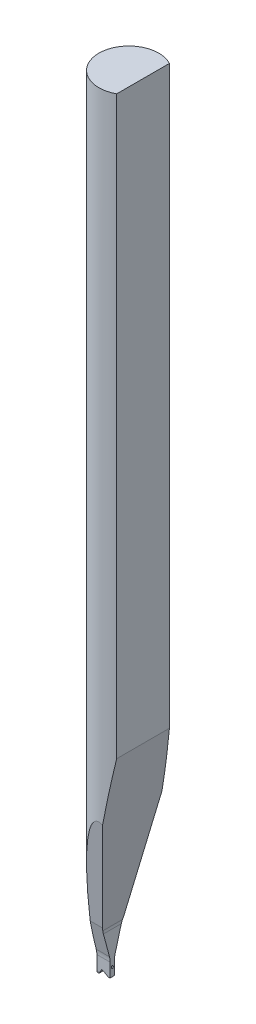
ISO-10303-21;
HEADER;
FILE_DESCRIPTION(('STEP AP214'),'2;1');
FILE_NAME('part.step','',(''),(''),'','','');
FILE_SCHEMA(('AUTOMOTIVE_DESIGN { 1 0 10303 214 1 1 1 1 }'));
ENDSEC;
DATA;
#1=APPLICATION_CONTEXT('core data for automotive mechanical design processes');
#2=APPLICATION_PROTOCOL_DEFINITION('international standard','automotive_design',2000,#1);
#3=PRODUCT_CONTEXT('',#1,'mechanical');
#4=PRODUCT('Part','Part','',(#3));
#5=PRODUCT_RELATED_PRODUCT_CATEGORY('part','',(#4));
#6=PRODUCT_DEFINITION_FORMATION('','',#4);
#7=PRODUCT_DEFINITION_CONTEXT('part definition',#1,'design');
#8=PRODUCT_DEFINITION('design','',#6,#7);
#9=PRODUCT_DEFINITION_SHAPE('','',#8);
#10=(LENGTH_UNIT() NAMED_UNIT(*) SI_UNIT(.MILLI.,.METRE.));
#11=(NAMED_UNIT(*) PLANE_ANGLE_UNIT() SI_UNIT($,.RADIAN.));
#12=(NAMED_UNIT(*) SI_UNIT($,.STERADIAN.) SOLID_ANGLE_UNIT());
#13=UNCERTAINTY_MEASURE_WITH_UNIT(LENGTH_MEASURE(1.E-05),#10,'distance_accuracy_value','');
#14=(GEOMETRIC_REPRESENTATION_CONTEXT(3) GLOBAL_UNCERTAINTY_ASSIGNED_CONTEXT((#13)) GLOBAL_UNIT_ASSIGNED_CONTEXT((#10,
#11,#12)) REPRESENTATION_CONTEXT('',''));
#15=CARTESIAN_POINT('',(0.,0.,0.));
#16=DIRECTION('',(0.,0.,1.));
#17=DIRECTION('',(1.,0.,0.));
#18=AXIS2_PLACEMENT_3D('',#15,#16,#17);
#19=CARTESIAN_POINT('',(26.8738719491216,0.,-0.0508));
#20=DIRECTION('',(0.,0.173648177666927,0.984807753012208));
#21=DIRECTION('',(0.,-0.984807753012209,0.173648177666927));
#22=AXIS2_PLACEMENT_3D('',#19,#20,#21);
#23=PLANE('',#22);
#24=DIRECTION('',(-0.49427041040807,-0.856101463504696,0.150953786239878));
#25=VECTOR('',#24,1.);
#26=CARTESIAN_POINT('',(6.01064718635582,11.6821755289432,-2.11068273912483));
#27=LINE('',#26,#25);
#28=CARTESIAN_POINT('',(-0.713268092858967,0.0360126395545259,-0.05715));
#29=VERTEX_POINT('',#28);
#30=CARTESIAN_POINT('',(-0.726727651581291,0.0126999999999957,-0.0530393526549967));
#31=VERTEX_POINT('',#30);
#32=EDGE_CURVE('E213',#29,#31,#27,.T.);
#33=ORIENTED_EDGE('',*,*,#32,.T.);
#34=CARTESIAN_POINT('',(-0.748724696837416,0.0254,-0.0552787053099949));
#35=DIRECTION('',(0.,0.173648177666927,0.984807753012208));
#36=DIRECTION('',(0.,-0.984807753012209,0.173648177666927));
#37=AXIS2_PLACEMENT_3D('',#34,#35,#36);
#38=ELLIPSE('',#37,0.0257918359418979,0.0254);
#39=CARTESIAN_POINT('',(-0.748724696837417,0.,-0.0508));
#40=VERTEX_POINT('',#39);
#41=EDGE_CURVE('E11',#31,#40,#38,.F.);
#42=ORIENTED_EDGE('',*,*,#41,.T.);
#43=DIRECTION('',(-1.,0.,0.));
#44=VECTOR('',#43,1.);
#45=CARTESIAN_POINT('',(26.8738719491216,0.,-0.0508));
#46=LINE('',#45,#44);
#47=CARTESIAN_POINT('',(-0.765396032391074,0.,-0.0508));
#48=VERTEX_POINT('',#47);
#49=EDGE_CURVE('E313',#40,#48,#46,.T.);
#50=ORIENTED_EDGE('',*,*,#49,.T.);
#51=CARTESIAN_POINT('',(-0.765396032391075,0.,-0.0508));
#52=CARTESIAN_POINT('',(-0.7668025377068,-1.30019635606427E-06,-0.0507997707403022));
#53=CARTESIAN_POINT('',(-0.768208814811664,0.000116241672625575,-0.0508204965431666));
#54=CARTESIAN_POINT('',(-0.77098052216773,0.000580888097255224,-0.0509024262443185));
#55=CARTESIAN_POINT('',(-0.772345985848006,0.000927799080594057,-0.0509635960105852));
#56=CARTESIAN_POINT('',(-0.774998983670717,0.00184336465673452,-0.0511250349242667));
#57=CARTESIAN_POINT('',(-0.776286470023878,0.00241215367265115,-0.0512253277741034));
#58=CARTESIAN_POINT('',(-0.778745824323787,0.00375450118883967,-0.0514620198586944));
#59=CARTESIAN_POINT('',(-0.779917714163149,0.00452802081294835,-0.0515984122385323));
#60=CARTESIAN_POINT('',(-0.782112782117624,0.00625682142307593,-0.051903246430363));
#61=CARTESIAN_POINT('',(-0.783136045101886,0.00721199795369106,-0.05207166982405));
#62=CARTESIAN_POINT('',(-0.785007120161919,0.00927677079875556,-0.052435744985669));
#63=CARTESIAN_POINT('',(-0.785854900675146,0.0103863948324469,-0.0526314016412513));
#64=CARTESIAN_POINT('',(-0.787359679409057,0.0127389562129212,-0.0530462216864017));
#65=CARTESIAN_POINT('',(-0.788014840256034,0.0139830318198768,-0.0532655857819492));
#66=CARTESIAN_POINT('',(-0.789107287961981,0.0165606350118712,-0.0537200867702581));
#67=CARTESIAN_POINT('',(-0.789544625225715,0.0178941418212571,-0.0539552199997113));
#68=CARTESIAN_POINT('',(-0.790107517305666,0.0202600033775736,-0.0543723852247108));
#69=CARTESIAN_POINT('',(-0.790284504455732,0.0212808224908233,-0.0545523831767996));
#70=CARTESIAN_POINT('',(-0.790511976215286,0.0233345874044375,-0.0549145173431022));
#71=CARTESIAN_POINT('',(-0.790562639039543,0.0243675140530945,-0.0550966501803532));
#72=CARTESIAN_POINT('',(-0.790549691758687,0.0253999999999247,-0.0552787053099816));
#73=B_SPLINE_CURVE_WITH_KNOTS('',3,(#51,#52,#53,#54,#55,#56,#57,#58,#59,#60,#61,#62,#63,#64,#65,
#66,#67,#68,#69,#70,#71,#72),.UNSPECIFIED.,.F.,.F.,(4,2,2,2,2,2,2,2,2,2,4),(0.,
0.00421411879651477,0.00842468568820049,0.0126378074915218,0.0168501298411226,
0.0210600373267433,0.0252707013560046,0.0295203160522539,0.0337689469227172,0.0369162992035178,
0.0400592087705206),.UNSPECIFIED.);
#74=CARTESIAN_POINT('',(-0.790549691758368,0.0254000000000009,-0.0552787053099945));
#75=VERTEX_POINT('',#74);
#76=EDGE_CURVE('E431',#48,#75,#73,.T.);
#77=ORIENTED_EDGE('',*,*,#76,.T.);
#78=CARTESIAN_POINT('',(0.,-0.288101116436582,0.));
#79=DIRECTION('',(0.,0.173648177666927,0.984807753012208));
#80=DIRECTION('',(0.,-0.984807753012209,0.173648177666927));
#81=AXIS2_PLACEMENT_3D('',#78,#79,#80);
#82=ELLIPSE('',#81,4.56371043248175,0.79248);
#83=CARTESIAN_POINT('',(-0.790416616664898,0.0360126395545731,-0.05715));
#84=VERTEX_POINT('',#83);
#85=EDGE_CURVE('E323',#84,#75,#82,.T.);
#86=ORIENTED_EDGE('',*,*,#85,.F.);
#87=DIRECTION('',(1.,0.,0.));
#88=VECTOR('',#87,1.);
#89=CARTESIAN_POINT('',(26.8738719491216,0.0360126395545731,-0.05715));
#90=LINE('',#89,#88);
#91=EDGE_CURVE('E442',#84,#29,#90,.T.);
#92=ORIENTED_EDGE('',*,*,#91,.T.);
#93=EDGE_LOOP('',(#33,#42,#50,#77,#86,#92));
#94=FACE_BOUND('',#93,.T.);
#95=ADVANCED_FACE('F40',(#94),#23,.F.);
#96=CARTESIAN_POINT('',(26.8738719491216,0.,0.0508));
#97=DIRECTION('',(0.,0.173648177666927,-0.984807753012208));
#98=DIRECTION('',(0.,0.984807753012209,0.173648177666927));
#99=AXIS2_PLACEMENT_3D('',#96,#97,#98);
#100=PLANE('',#99);
#101=CARTESIAN_POINT('',(0.,-0.288101116436582,0.));
#102=DIRECTION('',(0.,0.173648177666927,-0.984807753012208));
#103=DIRECTION('',(0.,-0.984807753012209,-0.173648177666927));
#104=AXIS2_PLACEMENT_3D('',#101,#102,#103);
#105=ELLIPSE('',#104,4.56371043248175,0.79248);
#106=CARTESIAN_POINT('',(-0.740366263471622,1.31479964505741,0.282634651649531));
#107=VERTEX_POINT('',#106);
#108=CARTESIAN_POINT('',(0.090264175576461,4.1770274203353,0.787322633364177));
#109=VERTEX_POINT('',#108);
#110=EDGE_CURVE('E322',#107,#109,#105,.T.);
#111=ORIENTED_EDGE('',*,*,#110,.F.);
#112=DIRECTION('',(1.,0.,0.));
#113=VECTOR('',#112,1.);
#114=CARTESIAN_POINT('',(26.8738719491216,1.31479964505741,0.282634651649531));
#115=LINE('',#114,#113);
#116=CARTESIAN_POINT('',(-0.414423806138194,1.31479964505743,0.282634651649535));
#117=VERTEX_POINT('',#116);
#118=EDGE_CURVE('E291',#107,#117,#115,.T.);
#119=ORIENTED_EDGE('',*,*,#118,.T.);
#120=DIRECTION('',(0.171087869746036,0.970287525247814,0.171087869746032));
#121=VECTOR('',#120,1.);
#122=CARTESIAN_POINT('',(0.159284907835618,4.56846344437336,0.856343365623333));
#123=LINE('',#122,#121);
#124=EDGE_CURVE('E338',#117,#109,#123,.T.);
#125=ORIENTED_EDGE('',*,*,#124,.T.);
#126=EDGE_LOOP('',(#111,#119,#125));
#127=FACE_BOUND('',#126,.T.);
#128=ADVANCED_FACE('F387',(#127),#100,.F.);
#129=CARTESIAN_POINT('',(0.,0.,0.));
#130=DIRECTION('',(0.,1.,0.));
#131=DIRECTION('',(0.,0.,1.));
#132=AXIS2_PLACEMENT_3D('',#129,#130,#131);
#133=PLANE('',#132);
#134=ORIENTED_EDGE('',*,*,#49,.F.);
#135=DIRECTION('',(0.,0.,1.));
#136=VECTOR('',#135,1.);
#137=CARTESIAN_POINT('',(-0.748724696837416,0.,0.));
#138=LINE('',#137,#136);
#139=CARTESIAN_POINT('',(-0.748724696837417,0.,0.0508));
#140=VERTEX_POINT('',#139);
#141=EDGE_CURVE('E676',#40,#140,#138,.T.);
#142=ORIENTED_EDGE('',*,*,#141,.T.);
#143=DIRECTION('',(-1.,0.,0.));
#144=VECTOR('',#143,1.);
#145=CARTESIAN_POINT('',(26.8738719491216,0.,0.0508));
#146=LINE('',#145,#144);
#147=CARTESIAN_POINT('',(-0.765396032391074,0.,0.0508));
#148=VERTEX_POINT('',#147);
#149=EDGE_CURVE('E316',#140,#148,#146,.T.);
#150=ORIENTED_EDGE('',*,*,#149,.T.);
#151=CARTESIAN_POINT('',(0.,0.,0.));
#152=DIRECTION('',(0.,1.,0.));
#153=DIRECTION('',(0.,0.,1.));
#154=AXIS2_PLACEMENT_3D('',#151,#152,#153);
#155=CIRCLE('',#154,0.76708);
#156=EDGE_CURVE('E376',#148,#48,#155,.F.);
#157=ORIENTED_EDGE('',*,*,#156,.T.);
#158=EDGE_LOOP('',(#134,#142,#150,#157));
#159=FACE_BOUND('',#158,.T.);
#160=ADVANCED_FACE('F395',(#159),#133,.F.);
#161=CARTESIAN_POINT('',(0.,21.0312,0.));
#162=DIRECTION('',(0.,-1.,0.));
#163=DIRECTION('',(0.,0.,-1.));
#164=AXIS2_PLACEMENT_3D('',#161,#162,#163);
#165=CYLINDRICAL_SURFACE('',#164,0.79248);
#166=ORIENTED_EDGE('',*,*,#85,.T.);
#167=CARTESIAN_POINT('',(0.,0.0253999999999983,0.));
#168=DIRECTION('',(0.,1.,0.));
#169=DIRECTION('',(0.,0.,1.));
#170=AXIS2_PLACEMENT_3D('',#167,#168,#169);
#171=CIRCLE('',#170,0.79248);
#172=CARTESIAN_POINT('',(-0.790549691758368,0.0253999999999988,0.0552787053099941));
#173=VERTEX_POINT('',#172);
#174=EDGE_CURVE('E365',#75,#173,#171,.T.);
#175=ORIENTED_EDGE('',*,*,#174,.T.);
#176=CARTESIAN_POINT('',(-0.790416616664898,0.0360126395545731,0.05715));
#177=VERTEX_POINT('',#176);
#178=EDGE_CURVE('E324',#173,#177,#105,.T.);
#179=ORIENTED_EDGE('',*,*,#178,.T.);
#180=DIRECTION('',(0.,-1.,0.));
#181=VECTOR('',#180,1.);
#182=CARTESIAN_POINT('',(-0.790416616664908,21.0312,0.0571499999999972));
#183=LINE('',#182,#181);
#184=CARTESIAN_POINT('',(-0.790416616664902,0.4064,0.05715));
#185=VERTEX_POINT('',#184);
#186=EDGE_CURVE('E284',#177,#185,#183,.F.);
#187=ORIENTED_EDGE('',*,*,#186,.T.);
#188=CARTESIAN_POINT('',(-0.790416616664908,0.4064,0.05715));
#189=CARTESIAN_POINT('',(-0.790439489960335,0.428694366525716,0.0571627673584451));
#190=CARTESIAN_POINT('',(-0.790330726145837,0.450798224070478,0.0586116247584144));
#191=CARTESIAN_POINT('',(-0.789849924358285,0.494624915610687,0.0643815189058058));
#192=CARTESIAN_POINT('',(-0.789477886452361,0.516347749703286,0.0687025549208876));
#193=CARTESIAN_POINT('',(-0.788974211503639,0.537880074912081,0.0744596802451533));
#194=B_SPLINE_CURVE_WITH_KNOTS('',3,(#188,#189,#190,#191,#192,#193),.UNSPECIFIED.,.F.,.F.,(4,2,
4),(0.,0.0664546749388415,0.132909332933258),.UNSPECIFIED.);
#195=CARTESIAN_POINT('',(-0.788974211503639,0.537880074912081,0.0744596802451533));
#196=VERTEX_POINT('',#195);
#197=EDGE_CURVE('E275',#185,#196,#194,.T.);
#198=ORIENTED_EDGE('',*,*,#197,.T.);
#199=CARTESIAN_POINT('',(0.,0.259992765121835,0.));
#200=DIRECTION('',(0.,0.258819045102521,-0.965925826289068));
#201=DIRECTION('',(0.,-0.965925826289068,-0.258819045102521));
#202=AXIS2_PLACEMENT_3D('',#199,#200,#201);
#203=ELLIPSE('',#202,3.06190759527023,0.79248);
#204=EDGE_CURVE('E294',#196,#107,#203,.T.);
#205=ORIENTED_EDGE('',*,*,#204,.T.);
#206=ORIENTED_EDGE('',*,*,#110,.T.);
#207=CARTESIAN_POINT('',(0.,3.66511384242575,0.));
#208=DIRECTION('',(-0.984807753012208,0.173648177666931,0.));
#209=DIRECTION('',(-0.173648177666931,-0.984807753012208,0.));
#210=AXIS2_PLACEMENT_3D('',#207,#208,#209);
#211=ELLIPSE('',#210,4.56371043248166,0.79248);
#212=CARTESIAN_POINT('',(0.37592,5.79706210405643,0.697645113220187));
#213=VERTEX_POINT('',#212);
#214=EDGE_CURVE('E304',#109,#213,#211,.T.);
#215=ORIENTED_EDGE('',*,*,#214,.T.);
#216=DIRECTION('',(0.,-1.,0.));
#217=VECTOR('',#216,1.);
#218=CARTESIAN_POINT('',(0.37592,21.0312,0.697645113220182));
#219=LINE('',#218,#217);
#220=CARTESIAN_POINT('',(0.37592,21.0312,0.697645113220182));
#221=VERTEX_POINT('',#220);
#222=EDGE_CURVE('E318',#221,#213,#219,.T.);
#223=ORIENTED_EDGE('',*,*,#222,.F.);
#224=CARTESIAN_POINT('',(0.,21.0312,0.));
#225=DIRECTION('',(0.,1.,0.));
#226=DIRECTION('',(0.,0.,1.));
#227=AXIS2_PLACEMENT_3D('',#224,#225,#226);
#228=CIRCLE('',#227,0.79248);
#229=CARTESIAN_POINT('',(0.37592,21.0312,-0.697645113220182));
#230=VERTEX_POINT('',#229);
#231=EDGE_CURVE('E326',#230,#221,#228,.T.);
#232=ORIENTED_EDGE('',*,*,#231,.F.);
#233=DIRECTION('',(0.,-1.,0.));
#234=VECTOR('',#233,1.);
#235=CARTESIAN_POINT('',(0.37592,21.0312,-0.697645113220182));
#236=LINE('',#235,#234);
#237=CARTESIAN_POINT('',(0.37592,5.79706210405643,-0.697645113220173));
#238=VERTEX_POINT('',#237);
#239=EDGE_CURVE('E331',#230,#238,#236,.T.);
#240=ORIENTED_EDGE('',*,*,#239,.T.);
#241=CARTESIAN_POINT('',(0.090264175576461,4.1770274203353,-0.787322633364177));
#242=VERTEX_POINT('',#241);
#243=EDGE_CURVE('E310',#238,#242,#211,.T.);
#244=ORIENTED_EDGE('',*,*,#243,.T.);
#245=CARTESIAN_POINT('',(-0.740366263471622,1.31479964505741,-0.282634651649531));
#246=VERTEX_POINT('',#245);
#247=EDGE_CURVE('E319',#242,#246,#82,.T.);
#248=ORIENTED_EDGE('',*,*,#247,.T.);
#249=CARTESIAN_POINT('',(0.,0.259992765121835,0.));
#250=DIRECTION('',(0.,0.258819045102521,0.965925826289068));
#251=DIRECTION('',(0.,-0.965925826289068,0.258819045102521));
#252=AXIS2_PLACEMENT_3D('',#249,#250,#251);
#253=ELLIPSE('',#252,3.06190759527023,0.79248);
#254=CARTESIAN_POINT('',(-0.788974211503625,0.537880074912081,-0.0744596802451533));
#255=VERTEX_POINT('',#254);
#256=EDGE_CURVE('E236',#246,#255,#253,.T.);
#257=ORIENTED_EDGE('',*,*,#256,.T.);
#258=CARTESIAN_POINT('',(-0.788974211503639,0.537880074912081,-0.0744596802451533));
#259=CARTESIAN_POINT('',(-0.789477886452361,0.516347749703286,-0.0687025549208876));
#260=CARTESIAN_POINT('',(-0.789849924358285,0.494624915610687,-0.0643815189058058));
#261=CARTESIAN_POINT('',(-0.790330726145837,0.450798224070478,-0.0586116247584144));
#262=CARTESIAN_POINT('',(-0.790439489960336,0.428694366525716,-0.057162767358445));
#263=CARTESIAN_POINT('',(-0.790416616664908,0.4064,-0.0571499999999999));
#264=B_SPLINE_CURVE_WITH_KNOTS('',3,(#258,#259,#260,#261,#262,#263),.UNSPECIFIED.,.F.,.F.,(4,2,
4),(0.,0.0664546579944162,0.132909332933258),.UNSPECIFIED.);
#265=CARTESIAN_POINT('',(-0.790416616664908,0.4064,-0.05715));
#266=VERTEX_POINT('',#265);
#267=EDGE_CURVE('E239',#255,#266,#264,.T.);
#268=ORIENTED_EDGE('',*,*,#267,.T.);
#269=DIRECTION('',(0.,-1.,0.));
#270=VECTOR('',#269,1.);
#271=CARTESIAN_POINT('',(-0.790416616664908,21.0312,-0.0571499999999972));
#272=LINE('',#271,#270);
#273=EDGE_CURVE('E426',#266,#84,#272,.T.);
#274=ORIENTED_EDGE('',*,*,#273,.T.);
#275=EDGE_LOOP('',(#166,#175,#179,#187,#198,#205,#206,#215,#223,#232,#240,#244,#248,#257,#268,#274));
#276=FACE_BOUND('',#275,.T.);
#277=ADVANCED_FACE('F249',(#276),#165,.T.);
#278=CARTESIAN_POINT('',(0.37592,21.0312,0.697645113220182));
#279=DIRECTION('',(-1.,0.,0.));
#280=DIRECTION('',(0.,0.,1.));
#281=AXIS2_PLACEMENT_3D('',#278,#279,#280);
#282=PLANE('',#281);
#283=ORIENTED_EDGE('',*,*,#222,.T.);
#284=DIRECTION('',(0.,0.,-1.));
#285=VECTOR('',#284,1.);
#286=CARTESIAN_POINT('',(0.37592,5.79706210405643,26.4674719491216));
#287=LINE('',#286,#285);
#288=EDGE_CURVE('E301',#213,#238,#287,.T.);
#289=ORIENTED_EDGE('',*,*,#288,.T.);
#290=ORIENTED_EDGE('',*,*,#239,.F.);
#291=DIRECTION('',(0.,0.,-1.));
#292=VECTOR('',#291,1.);
#293=CARTESIAN_POINT('',(0.37592,21.0312,0.697645113220182));
#294=LINE('',#293,#292);
#295=EDGE_CURVE('E329',#221,#230,#294,.T.);
#296=ORIENTED_EDGE('',*,*,#295,.F.);
#297=EDGE_LOOP('',(#283,#289,#290,#296));
#298=FACE_BOUND('',#297,.T.);
#299=ADVANCED_FACE('F393',(#298),#282,.F.);
#300=CARTESIAN_POINT('',(0.,21.0312,0.));
#301=DIRECTION('',(0.,1.,0.));
#302=DIRECTION('',(0.,0.,1.));
#303=AXIS2_PLACEMENT_3D('',#300,#301,#302);
#304=PLANE('',#303);
#305=ORIENTED_EDGE('',*,*,#231,.T.);
#306=ORIENTED_EDGE('',*,*,#295,.T.);
#307=EDGE_LOOP('',(#305,#306));
#308=FACE_BOUND('',#307,.T.);
#309=ADVANCED_FACE('F390',(#308),#304,.T.);
#310=DIRECTION('',(-0.171087869746036,-0.970287525247814,0.171087869746032));
#311=VECTOR('',#310,1.);
#312=CARTESIAN_POINT('',(0.159284907835618,4.56846344437336,-0.856343365623333));
#313=LINE('',#312,#311);
#314=CARTESIAN_POINT('',(-0.414423806138194,1.31479964505743,-0.282634651649537));
#315=VERTEX_POINT('',#314);
#316=EDGE_CURVE('E309',#242,#315,#313,.T.);
#317=ORIENTED_EDGE('',*,*,#316,.T.);
#318=DIRECTION('',(-1.,0.,0.));
#319=VECTOR('',#318,1.);
#320=CARTESIAN_POINT('',(26.8738719491216,1.31479964505741,-0.282634651649531));
#321=LINE('',#320,#319);
#322=EDGE_CURVE('E233',#315,#246,#321,.T.);
#323=ORIENTED_EDGE('',*,*,#322,.T.);
#324=ORIENTED_EDGE('',*,*,#247,.F.);
#325=EDGE_LOOP('',(#317,#323,#324));
#326=FACE_BOUND('',#325,.T.);
#327=ADVANCED_FACE('F386',(#326),#23,.F.);
#328=ORIENTED_EDGE('',*,*,#149,.F.);
#329=CARTESIAN_POINT('',(-0.748724696837416,0.0254,0.0552787053099949));
#330=DIRECTION('',(0.,0.173648177666927,-0.984807753012208));
#331=DIRECTION('',(0.,0.984807753012209,0.173648177666927));
#332=AXIS2_PLACEMENT_3D('',#329,#330,#331);
#333=ELLIPSE('',#332,0.0257918359418979,0.0254);
#334=CARTESIAN_POINT('',(-0.726727651581291,0.0126999999999957,0.0530393526549967));
#335=VERTEX_POINT('',#334);
#336=EDGE_CURVE('E62',#140,#335,#333,.F.);
#337=ORIENTED_EDGE('',*,*,#336,.T.);
#338=DIRECTION('',(0.49427041040807,0.856101463504696,0.150953786239878));
#339=VECTOR('',#338,1.);
#340=CARTESIAN_POINT('',(6.01064718635582,11.6821755289432,2.11068273912483));
#341=LINE('',#340,#339);
#342=CARTESIAN_POINT('',(-0.713268092858967,0.0360126395545259,0.05715));
#343=VERTEX_POINT('',#342);
#344=EDGE_CURVE('E192',#335,#343,#341,.T.);
#345=ORIENTED_EDGE('',*,*,#344,.T.);
#346=DIRECTION('',(-1.,0.,0.));
#347=VECTOR('',#346,1.);
#348=CARTESIAN_POINT('',(26.8738719491216,0.0360126395545731,0.05715));
#349=LINE('',#348,#347);
#350=EDGE_CURVE('E435',#343,#177,#349,.T.);
#351=ORIENTED_EDGE('',*,*,#350,.T.);
#352=ORIENTED_EDGE('',*,*,#178,.F.);
#353=CARTESIAN_POINT('',(-0.790549691758368,0.0253999999999983,0.055278705309994));
#354=CARTESIAN_POINT('',(-0.790568499744369,0.0239705829901058,0.0550266605244668));
#355=CARTESIAN_POINT('',(-0.790463934378654,0.0225397039526685,0.0547743579440366));
#356=CARTESIAN_POINT('',(-0.790014515516168,0.0197151707661977,0.0542763165353554));
#357=CARTESIAN_POINT('',(-0.78966968634322,0.0183215128638002,0.0540305770452852));
#358=CARTESIAN_POINT('',(-0.788745805013242,0.0156101071691054,0.0535524830656639));
#359=CARTESIAN_POINT('',(-0.788166552931448,0.0142924252706662,0.0533201401949779));
#360=CARTESIAN_POINT('',(-0.7867891970827,0.0117736573119871,0.0528760134457188));
#361=CARTESIAN_POINT('',(-0.78599118087936,0.0105725248609823,0.0526642213872022));
#362=CARTESIAN_POINT('',(-0.784208612267366,0.00833615762232048,0.0522698895042536));
#363=CARTESIAN_POINT('',(-0.783226404552837,0.00729911079630225,0.0520870301685685));
#364=CARTESIAN_POINT('',(-0.781096551365659,0.00540493600327271,0.0517530360463795));
#365=CARTESIAN_POINT('',(-0.779948884758434,0.00454783105520113,0.0516019053187358));
#366=CARTESIAN_POINT('',(-0.777539225875822,0.0030509082967586,0.0513379574483858));
#367=CARTESIAN_POINT('',(-0.776279136893455,0.00240811445941874,0.0512246155518297));
#368=CARTESIAN_POINT('',(-0.773666931678152,0.0013419883510002,0.0510366287540778));
#369=CARTESIAN_POINT('',(-0.772314869535047,0.000918528329725311,0.0509619613270757));
#370=CARTESIAN_POINT('',(-0.770028113456195,0.000407527489767996,0.0508718580918265));
#371=CARTESIAN_POINT('',(-0.769107899358952,0.000254717858666491,0.0508449136309512));
#372=CARTESIAN_POINT('',(-0.76725725321673,5.09573214590332E-05,0.0508089851506379));
#373=CARTESIAN_POINT('',(-0.766326837752019,-1.3961535734153E-07,0.0507999753820456));
#374=CARTESIAN_POINT('',(-0.765396032391098,0.,0.050799999999983));
#375=B_SPLINE_CURVE_WITH_KNOTS('',3,(#353,#354,#355,#356,#357,#358,#359,#360,#361,#362,#363,
#364,#365,#366,#367,#368,#369,#370,#371,#372,#373,#374),.UNSPECIFIED.,.F.,.F.,(4,2,2,2,2,2,2,2,
2,2,4),(0.,0.00434964153441994,0.00869884278388604,0.0130517610402942,0.0174029395135876,
0.0217020869577994,0.0260017840327996,0.0302390110323467,0.0344737672910665,0.0372679758913299,
0.0400581698951772),.UNSPECIFIED.);
#376=EDGE_CURVE('E368',#173,#148,#375,.T.);
#377=ORIENTED_EDGE('',*,*,#376,.T.);
#378=EDGE_LOOP('',(#328,#337,#345,#351,#352,#377));
#379=FACE_BOUND('',#378,.T.);
#380=ADVANCED_FACE('F380',(#379),#100,.F.);
#381=CARTESIAN_POINT('',(-0.69088,0.,26.4674719491216));
#382=DIRECTION('',(-0.173648177666931,0.984807753012208,0.));
#383=DIRECTION('',(-0.984807753012208,-0.173648177666931,0.));
#384=AXIS2_PLACEMENT_3D('',#381,#382,#383);
#385=PLANE('',#384);
#386=DIRECTION('',(-0.984807753012208,-0.173648177666931,0.));
#387=VECTOR('',#386,1.);
#388=CARTESIAN_POINT('',(-0.690880000000001,0.,0.0571499999999989));
#389=LINE('',#388,#387);
#390=CARTESIAN_POINT('',(-0.43688,0.0447870530999504,0.0571499999999989));
#391=VERTEX_POINT('',#390);
#392=CARTESIAN_POINT('',(-0.482834169941549,0.0366840930631976,0.0571499999999994));
#393=VERTEX_POINT('',#392);
#394=EDGE_CURVE('E438',#391,#393,#389,.T.);
#395=ORIENTED_EDGE('',*,*,#394,.T.);
#396=DIRECTION('',(0.,0.,-1.));
#397=VECTOR('',#396,1.);
#398=CARTESIAN_POINT('',(-0.482834169941541,0.0366840930631946,26.4674719491216));
#399=LINE('',#398,#397);
#400=CARTESIAN_POINT('',(-0.482834169941541,0.0366840930631946,-0.0571499999999989));
#401=VERTEX_POINT('',#400);
#402=EDGE_CURVE('E206',#393,#401,#399,.T.);
#403=ORIENTED_EDGE('',*,*,#402,.T.);
#404=DIRECTION('',(0.984807753012208,0.173648177666931,0.));
#405=VECTOR('',#404,1.);
#406=CARTESIAN_POINT('',(-0.690879999999999,0.,-0.0571499999999989));
#407=LINE('',#406,#405);
#408=CARTESIAN_POINT('',(-0.43688,0.0447870530999506,-0.0571499999999989));
#409=VERTEX_POINT('',#408);
#410=EDGE_CURVE('E205',#401,#409,#407,.T.);
#411=ORIENTED_EDGE('',*,*,#410,.T.);
#412=DIRECTION('',(0.,0.,1.));
#413=VECTOR('',#412,1.);
#414=CARTESIAN_POINT('',(-0.43688,0.0447870530999504,26.4674719491216));
#415=LINE('',#414,#413);
#416=EDGE_CURVE('E315',#409,#391,#415,.T.);
#417=ORIENTED_EDGE('',*,*,#416,.T.);
#418=EDGE_LOOP('',(#395,#403,#411,#417));
#419=FACE_BOUND('',#418,.T.);
#420=ADVANCED_FACE('F385',(#419),#385,.F.);
#421=CARTESIAN_POINT('',(-0.429162338530202,1.2312132742548,26.4674719491216));
#422=DIRECTION('',(-0.984807753012208,0.173648177666931,0.));
#423=DIRECTION('',(-0.173648177666931,-0.984807753012208,0.));
#424=AXIS2_PLACEMENT_3D('',#421,#422,#423);
#425=PLANE('',#424);
#426=ORIENTED_EDGE('',*,*,#124,.F.);
#427=DIRECTION('',(-0.167900917937429,-0.952213423395662,-0.255144817820943));
#428=VECTOR('',#427,1.);
#429=CARTESIAN_POINT('',(0.693530654555205,7.59832163495225,1.96629929446506));
#430=LINE('',#429,#428);
#431=CARTESIAN_POINT('',(-0.429162338530202,1.2312132742548,0.260237751094725));
#432=VERTEX_POINT('',#431);
#433=EDGE_CURVE('E288',#117,#432,#430,.T.);
#434=ORIENTED_EDGE('',*,*,#433,.T.);
#435=DIRECTION('',(0.,0.,-1.));
#436=VECTOR('',#435,1.);
#437=CARTESIAN_POINT('',(-0.429162338530202,1.2312132742548,26.4674719491216));
#438=LINE('',#437,#436);
#439=CARTESIAN_POINT('',(-0.429162338530202,1.2312132742548,-0.260237751094728));
#440=VERTEX_POINT('',#439);
#441=EDGE_CURVE('E300',#432,#440,#438,.T.);
#442=ORIENTED_EDGE('',*,*,#441,.T.);
#443=DIRECTION('',(0.167900917937429,0.952213423395662,-0.255144817820943));
#444=VECTOR('',#443,1.);
#445=CARTESIAN_POINT('',(-1.5741520072192,-5.2623458174312,1.47970616352631));
#446=LINE('',#445,#444);
#447=EDGE_CURVE('E230',#440,#315,#446,.T.);
#448=ORIENTED_EDGE('',*,*,#447,.T.);
#449=ORIENTED_EDGE('',*,*,#316,.F.);
#450=ORIENTED_EDGE('',*,*,#243,.F.);
#451=ORIENTED_EDGE('',*,*,#288,.F.);
#452=ORIENTED_EDGE('',*,*,#214,.F.);
#453=EDGE_LOOP('',(#426,#434,#442,#448,#449,#450,#451,#452));
#454=FACE_BOUND('',#453,.T.);
#455=ADVANCED_FACE('F418',(#454),#425,.F.);
#456=CARTESIAN_POINT('',(0.0711200000000001,1.143,26.4674719491216));
#457=DIRECTION('',(0.,0.,-1.));
#458=DIRECTION('',(-1.,0.,0.));
#459=AXIS2_PLACEMENT_3D('',#456,#457,#458);
#460=CYLINDRICAL_SURFACE('',#459,0.508);
#461=ORIENTED_EDGE('',*,*,#441,.F.);
#462=CARTESIAN_POINT('',(0.0711200000000001,1.143,0.236601075496445));
#463=DIRECTION('',(0.,0.258819045102521,-0.965925826289068));
#464=DIRECTION('',(0.,-0.965925826289068,-0.258819045102521));
#465=AXIS2_PLACEMENT_3D('',#462,#463,#464);
#466=ELLIPSE('',#465,0.525920299648322,0.508);
#467=CARTESIAN_POINT('',(-0.43688,1.143,0.236601075496444));
#468=VERTEX_POINT('',#467);
#469=EDGE_CURVE('E283',#432,#468,#466,.F.);
#470=ORIENTED_EDGE('',*,*,#469,.T.);
#471=DIRECTION('',(0.,0.,-1.));
#472=VECTOR('',#471,1.);
#473=CARTESIAN_POINT('',(-0.43688,1.143,26.4674719491216));
#474=LINE('',#473,#472);
#475=CARTESIAN_POINT('',(-0.43688,1.143,-0.236601075496445));
#476=VERTEX_POINT('',#475);
#477=EDGE_CURVE('E297',#468,#476,#474,.T.);
#478=ORIENTED_EDGE('',*,*,#477,.T.);
#479=CARTESIAN_POINT('',(0.0711200000000001,1.143,-0.236601075496445));
#480=DIRECTION('',(0.,0.258819045102521,0.965925826289068));
#481=DIRECTION('',(0.,0.965925826289068,-0.258819045102521));
#482=AXIS2_PLACEMENT_3D('',#479,#480,#481);
#483=ELLIPSE('',#482,0.525920299648322,0.508);
#484=EDGE_CURVE('E227',#476,#440,#483,.F.);
#485=ORIENTED_EDGE('',*,*,#484,.T.);
#486=EDGE_LOOP('',(#461,#470,#478,#485));
#487=FACE_BOUND('',#486,.T.);
#488=ADVANCED_FACE('F454',(#487),#460,.F.);
#489=CARTESIAN_POINT('',(-0.43688,0.,26.4674719491216));
#490=DIRECTION('',(-1.,0.,0.));
#491=DIRECTION('',(0.,0.,1.));
#492=AXIS2_PLACEMENT_3D('',#489,#490,#491);
#493=PLANE('',#492);
#494=CARTESIAN_POINT('',(-0.43688,0.266690884248374,0.));
#495=DIRECTION('',(-1.,0.,0.));
#496=DIRECTION('',(0.,-1.,0.));
#497=AXIS2_PLACEMENT_3D('',#494,#495,#496);
#498=ELLIPSE('',#497,0.0359210244842769,0.0254000000000001);
#499=CARTESIAN_POINT('',(-0.43688,0.230769859764097,0.));
#500=VERTEX_POINT('',#499);
#501=EDGE_CURVE('E200',#500,#500,#498,.T.);
#502=ORIENTED_EDGE('',*,*,#501,.T.);
#503=EDGE_LOOP('',(#502));
#504=FACE_BOUND('',#503,.T.);
#505=ORIENTED_EDGE('',*,*,#477,.F.);
#506=DIRECTION('',(0.,-0.965925826289068,-0.258819045102521));
#507=VECTOR('',#506,1.);
#508=CARTESIAN_POINT('',(-0.43688,6.6342842001435,1.70798624233468));
#509=LINE('',#508,#507);
#510=CARTESIAN_POINT('',(-0.436879999999994,0.537880074912081,0.0744596802451533));
#511=VERTEX_POINT('',#510);
#512=EDGE_CURVE('E356',#468,#511,#509,.T.);
#513=ORIENTED_EDGE('',*,*,#512,.T.);
#514=CARTESIAN_POINT('',(-0.436880000000001,0.4064,0.56515));
#515=DIRECTION('',(-1.,0.,0.));
#516=DIRECTION('',(0.,0.,1.));
#517=AXIS2_PLACEMENT_3D('',#514,#515,#516);
#518=CIRCLE('',#517,0.508);
#519=CARTESIAN_POINT('',(-0.436879999999994,0.4064,0.05715));
#520=VERTEX_POINT('',#519);
#521=EDGE_CURVE('E353',#511,#520,#518,.T.);
#522=ORIENTED_EDGE('',*,*,#521,.T.);
#523=DIRECTION('',(0.,-1.,0.));
#524=VECTOR('',#523,1.);
#525=CARTESIAN_POINT('',(-0.43688,0.,0.0571499999999989));
#526=LINE('',#525,#524);
#527=EDGE_CURVE('E350',#520,#391,#526,.T.);
#528=ORIENTED_EDGE('',*,*,#527,.T.);
#529=ORIENTED_EDGE('',*,*,#416,.F.);
#530=DIRECTION('',(0.,1.,0.));
#531=VECTOR('',#530,1.);
#532=CARTESIAN_POINT('',(-0.43688,0.,-0.0571499999999989));
#533=LINE('',#532,#531);
#534=CARTESIAN_POINT('',(-0.436879999999994,0.4064,-0.05715));
#535=VERTEX_POINT('',#534);
#536=EDGE_CURVE('E347',#409,#535,#533,.T.);
#537=ORIENTED_EDGE('',*,*,#536,.T.);
#538=CARTESIAN_POINT('',(-0.436880000000001,0.4064,-0.56515));
#539=DIRECTION('',(-1.,0.,0.));
#540=DIRECTION('',(0.,0.,1.));
#541=AXIS2_PLACEMENT_3D('',#538,#539,#540);
#542=CIRCLE('',#541,0.508);
#543=CARTESIAN_POINT('',(-0.436879999999994,0.537880074912081,-0.0744596802451533));
#544=VERTEX_POINT('',#543);
#545=EDGE_CURVE('E344',#535,#544,#542,.T.);
#546=ORIENTED_EDGE('',*,*,#545,.T.);
#547=DIRECTION('',(0.,0.965925826289068,-0.258819045102521));
#548=VECTOR('',#547,1.);
#549=CARTESIAN_POINT('',(-0.43688,-6.59945177441733,1.8379826248956));
#550=LINE('',#549,#548);
#551=EDGE_CURVE('E341',#544,#476,#550,.T.);
#552=ORIENTED_EDGE('',*,*,#551,.T.);
#553=EDGE_LOOP('',(#505,#513,#522,#528,#529,#537,#546,#552));
#554=FACE_BOUND('',#553,.T.);
#555=ADVANCED_FACE('F448',(#504,#554),#493,.F.);
#556=CARTESIAN_POINT('',(27.2675719491216,0.537880074912081,-0.0744596802451533));
#557=DIRECTION('',(0.,0.258819045102521,0.965925826289068));
#558=DIRECTION('',(0.,-0.965925826289068,0.258819045102521));
#559=AXIS2_PLACEMENT_3D('',#556,#557,#558);
#560=PLANE('',#559);
#561=ORIENTED_EDGE('',*,*,#256,.F.);
#562=ORIENTED_EDGE('',*,*,#322,.F.);
#563=ORIENTED_EDGE('',*,*,#447,.F.);
#564=ORIENTED_EDGE('',*,*,#484,.F.);
#565=ORIENTED_EDGE('',*,*,#551,.F.);
#566=DIRECTION('',(-1.,0.,0.));
#567=VECTOR('',#566,1.);
#568=CARTESIAN_POINT('',(27.2675719491216,0.537880074912081,-0.0744596802451533));
#569=LINE('',#568,#567);
#570=EDGE_CURVE('E215',#544,#255,#569,.T.);
#571=ORIENTED_EDGE('',*,*,#570,.T.);
#572=EDGE_LOOP('',(#561,#562,#563,#564,#565,#571));
#573=FACE_BOUND('',#572,.T.);
#574=ADVANCED_FACE('F257',(#573),#560,.F.);
#575=CARTESIAN_POINT('',(27.2675719491216,0.4064,-0.56515));
#576=DIRECTION('',(-1.,0.,0.));
#577=DIRECTION('',(0.,0.,1.));
#578=AXIS2_PLACEMENT_3D('',#575,#576,#577);
#579=CYLINDRICAL_SURFACE('',#578,0.508);
#580=ORIENTED_EDGE('',*,*,#267,.F.);
#581=ORIENTED_EDGE('',*,*,#570,.F.);
#582=ORIENTED_EDGE('',*,*,#545,.F.);
#583=DIRECTION('',(-1.,0.,0.));
#584=VECTOR('',#583,1.);
#585=CARTESIAN_POINT('',(27.2675719491216,0.4064,-0.05715));
#586=LINE('',#585,#584);
#587=EDGE_CURVE('E218',#535,#266,#586,.T.);
#588=ORIENTED_EDGE('',*,*,#587,.T.);
#589=EDGE_LOOP('',(#580,#581,#582,#588));
#590=FACE_BOUND('',#589,.T.);
#591=ADVANCED_FACE('F252',(#590),#579,.F.);
#592=CARTESIAN_POINT('',(27.2675719491216,0.,-0.05715));
#593=DIRECTION('',(0.,0.,1.));
#594=DIRECTION('',(0.,-1.,0.));
#595=AXIS2_PLACEMENT_3D('',#592,#593,#594);
#596=PLANE('',#595);
#597=CARTESIAN_POINT('',(-0.646071818975501,0.1016,-0.05715));
#598=DIRECTION('',(0.,0.,1.));
#599=DIRECTION('',(0.,-1.,0.));
#600=AXIS2_PLACEMENT_3D('',#597,#598,#599);
#601=CIRCLE('',#600,0.0254);
#602=CARTESIAN_POINT('',(-0.633371818975501,0.123597045256125,-0.05715));
#603=VERTEX_POINT('',#602);
#604=CARTESIAN_POINT('',(-0.668068864231625,0.1143,-0.05715));
#605=VERTEX_POINT('',#604);
#606=EDGE_CURVE('E182',#603,#605,#601,.T.);
#607=ORIENTED_EDGE('',*,*,#606,.T.);
#608=DIRECTION('',(-0.500000000000001,-0.866025403784438,0.));
#609=VECTOR('',#608,1.);
#610=CARTESIAN_POINT('',(6.26634798728043,12.1250623076806,-0.0571499999999984));
#611=LINE('',#610,#609);
#612=EDGE_CURVE('E211',#605,#29,#611,.T.);
#613=ORIENTED_EDGE('',*,*,#612,.T.);
#614=ORIENTED_EDGE('',*,*,#91,.F.);
#615=ORIENTED_EDGE('',*,*,#273,.F.);
#616=ORIENTED_EDGE('',*,*,#587,.F.);
#617=ORIENTED_EDGE('',*,*,#536,.F.);
#618=ORIENTED_EDGE('',*,*,#410,.F.);
#619=DIRECTION('',(-0.866025403784438,0.500000000000001,0.));
#620=VECTOR('',#619,1.);
#621=CARTESIAN_POINT('',(20.3458550976095,-11.9887652624245,-0.0571500000000016));
#622=LINE('',#621,#620);
#623=EDGE_CURVE('E193',#401,#603,#622,.T.);
#624=ORIENTED_EDGE('',*,*,#623,.T.);
#625=EDGE_LOOP('',(#607,#613,#614,#615,#616,#617,#618,#624));
#626=FACE_BOUND('',#625,.T.);
#627=ADVANCED_FACE('F203',(#626),#596,.F.);
#628=CARTESIAN_POINT('',(27.2675719491216,0.537880074912081,0.0744596802451533));
#629=DIRECTION('',(0.,0.258819045102521,-0.965925826289068));
#630=DIRECTION('',(0.,0.965925826289068,0.258819045102521));
#631=AXIS2_PLACEMENT_3D('',#628,#629,#630);
#632=PLANE('',#631);
#633=ORIENTED_EDGE('',*,*,#204,.F.);
#634=DIRECTION('',(-1.,0.,0.));
#635=VECTOR('',#634,1.);
#636=CARTESIAN_POINT('',(27.2675719491216,0.537880074912081,0.0744596802451533));
#637=LINE('',#636,#635);
#638=EDGE_CURVE('E224',#511,#196,#637,.T.);
#639=ORIENTED_EDGE('',*,*,#638,.F.);
#640=ORIENTED_EDGE('',*,*,#512,.F.);
#641=ORIENTED_EDGE('',*,*,#469,.F.);
#642=ORIENTED_EDGE('',*,*,#433,.F.);
#643=ORIENTED_EDGE('',*,*,#118,.F.);
#644=EDGE_LOOP('',(#633,#639,#640,#641,#642,#643));
#645=FACE_BOUND('',#644,.T.);
#646=ADVANCED_FACE('F262',(#645),#632,.F.);
#647=CARTESIAN_POINT('',(27.2675719491216,0.4064,0.56515));
#648=DIRECTION('',(-1.,0.,0.));
#649=DIRECTION('',(0.,0.,1.));
#650=AXIS2_PLACEMENT_3D('',#647,#648,#649);
#651=CYLINDRICAL_SURFACE('',#650,0.508);
#652=ORIENTED_EDGE('',*,*,#197,.F.);
#653=DIRECTION('',(-1.,0.,0.));
#654=VECTOR('',#653,1.);
#655=CARTESIAN_POINT('',(27.2675719491216,0.4064,0.05715));
#656=LINE('',#655,#654);
#657=EDGE_CURVE('E221',#520,#185,#656,.T.);
#658=ORIENTED_EDGE('',*,*,#657,.F.);
#659=ORIENTED_EDGE('',*,*,#521,.F.);
#660=ORIENTED_EDGE('',*,*,#638,.T.);
#661=EDGE_LOOP('',(#652,#658,#659,#660));
#662=FACE_BOUND('',#661,.T.);
#663=ADVANCED_FACE('F267',(#662),#651,.F.);
#664=CARTESIAN_POINT('',(27.2675719491216,0.,0.05715));
#665=DIRECTION('',(0.,0.,-1.));
#666=DIRECTION('',(0.,1.,0.));
#667=AXIS2_PLACEMENT_3D('',#664,#665,#666);
#668=PLANE('',#667);
#669=ORIENTED_EDGE('',*,*,#350,.F.);
#670=DIRECTION('',(0.500000000000001,0.866025403784438,0.));
#671=VECTOR('',#670,1.);
#672=CARTESIAN_POINT('',(6.26634798728043,12.1250623076806,0.0571499999999984));
#673=LINE('',#672,#671);
#674=CARTESIAN_POINT('',(-0.668068864231625,0.1143,0.05715));
#675=VERTEX_POINT('',#674);
#676=EDGE_CURVE('E362',#343,#675,#673,.T.);
#677=ORIENTED_EDGE('',*,*,#676,.T.);
#678=CARTESIAN_POINT('',(-0.646071818975501,0.1016,0.05715));
#679=DIRECTION('',(0.,0.,-1.));
#680=DIRECTION('',(0.,1.,0.));
#681=AXIS2_PLACEMENT_3D('',#678,#679,#680);
#682=CIRCLE('',#681,0.0254);
#683=CARTESIAN_POINT('',(-0.633371818975501,0.123597045256125,0.05715));
#684=VERTEX_POINT('',#683);
#685=EDGE_CURVE('E360',#675,#684,#682,.T.);
#686=ORIENTED_EDGE('',*,*,#685,.T.);
#687=DIRECTION('',(0.866025403784438,-0.500000000000001,0.));
#688=VECTOR('',#687,1.);
#689=CARTESIAN_POINT('',(20.3458550976095,-11.9887652624245,0.0571500000000016));
#690=LINE('',#689,#688);
#691=EDGE_CURVE('E199',#684,#393,#690,.T.);
#692=ORIENTED_EDGE('',*,*,#691,.T.);
#693=ORIENTED_EDGE('',*,*,#394,.F.);
#694=ORIENTED_EDGE('',*,*,#527,.F.);
#695=ORIENTED_EDGE('',*,*,#657,.T.);
#696=ORIENTED_EDGE('',*,*,#186,.F.);
#697=EDGE_LOOP('',(#669,#677,#686,#692,#693,#694,#695,#696));
#698=FACE_BOUND('',#697,.T.);
#699=ADVANCED_FACE('F263',(#698),#668,.F.);
#700=CARTESIAN_POINT('',(-0.73406,0.,-0.79248));
#701=DIRECTION('',(-0.866025403784438,0.500000000000001,0.));
#702=DIRECTION('',(-0.500000000000001,-0.866025403784438,0.));
#703=AXIS2_PLACEMENT_3D('',#700,#701,#702);
#704=PLANE('',#703);
#705=ORIENTED_EDGE('',*,*,#344,.F.);
#706=DIRECTION('',(0.,0.,1.));
#707=VECTOR('',#706,1.);
#708=CARTESIAN_POINT('',(-0.726727651581292,0.0127,-0.79248));
#709=LINE('',#708,#707);
#710=EDGE_CURVE('E48',#335,#31,#709,.F.);
#711=ORIENTED_EDGE('',*,*,#710,.T.);
#712=ORIENTED_EDGE('',*,*,#32,.F.);
#713=ORIENTED_EDGE('',*,*,#612,.F.);
#714=DIRECTION('',(0.,0.,1.));
#715=VECTOR('',#714,1.);
#716=CARTESIAN_POINT('',(-0.668068864231625,0.1143,-0.79248));
#717=LINE('',#716,#715);
#718=EDGE_CURVE('E188',#605,#675,#717,.T.);
#719=ORIENTED_EDGE('',*,*,#718,.T.);
#720=ORIENTED_EDGE('',*,*,#676,.F.);
#721=EDGE_LOOP('',(#705,#711,#712,#713,#719,#720));
#722=FACE_BOUND('',#721,.T.);
#723=ADVANCED_FACE('F266',(#722),#704,.F.);
#724=CARTESIAN_POINT('',(-0.646071818975501,0.1016,-0.79248));
#725=DIRECTION('',(0.,0.,1.));
#726=DIRECTION('',(1.,0.,0.));
#727=AXIS2_PLACEMENT_3D('',#724,#725,#726);
#728=CYLINDRICAL_SURFACE('',#727,0.0254);
#729=DIRECTION('',(0.,0.,1.));
#730=VECTOR('',#729,1.);
#731=CARTESIAN_POINT('',(-0.633371818975501,0.123597045256125,-0.79248));
#732=LINE('',#731,#730);
#733=EDGE_CURVE('E185',#603,#684,#732,.T.);
#734=ORIENTED_EDGE('',*,*,#733,.T.);
#735=ORIENTED_EDGE('',*,*,#685,.F.);
#736=ORIENTED_EDGE('',*,*,#718,.F.);
#737=ORIENTED_EDGE('',*,*,#606,.F.);
#738=EDGE_LOOP('',(#734,#735,#736,#737));
#739=FACE_BOUND('',#738,.T.);
#740=ADVANCED_FACE('F184',(#739),#728,.F.);
#741=CARTESIAN_POINT('',(-0.633371818975501,0.123597045256125,-0.79248));
#742=DIRECTION('',(0.500000000000001,0.866025403784438,0.));
#743=DIRECTION('',(-0.866025403784438,0.500000000000001,0.));
#744=AXIS2_PLACEMENT_3D('',#741,#742,#743);
#745=PLANE('',#744);
#746=CARTESIAN_POINT('',(-0.599518856176892,0.104052028071481,0.));
#747=DIRECTION('',(0.500000000000001,0.866025403784438,0.));
#748=DIRECTION('',(-0.866025403784438,0.500000000000001,0.));
#749=AXIS2_PLACEMENT_3D('',#746,#747,#748);
#750=ELLIPSE('',#749,0.0262960149824162,0.0254000000000001);
#751=CARTESIAN_POINT('',(-0.622291873169961,0.11720003556269,0.));
#752=VERTEX_POINT('',#751);
#753=EDGE_CURVE('E688',#752,#752,#750,.F.);
#754=ORIENTED_EDGE('',*,*,#753,.F.);
#755=EDGE_LOOP('',(#754));
#756=FACE_BOUND('',#755,.T.);
#757=ORIENTED_EDGE('',*,*,#402,.F.);
#758=ORIENTED_EDGE('',*,*,#691,.F.);
#759=ORIENTED_EDGE('',*,*,#733,.F.);
#760=ORIENTED_EDGE('',*,*,#623,.F.);
#761=EDGE_LOOP('',(#757,#758,#759,#760));
#762=FACE_BOUND('',#761,.T.);
#763=ADVANCED_FACE('F196',(#756,#762),#745,.F.);
#764=CARTESIAN_POINT('',(-0.721531396490511,-0.0179605122421382,0.));
#765=DIRECTION('',(-0.707106781186546,-0.707106781186549,0.));
#766=DIRECTION('',(0.707106781186549,-0.707106781186546,0.));
#767=AXIS2_PLACEMENT_3D('',#764,#765,#766);
#768=CYLINDRICAL_SURFACE('',#767,0.0254000000000001);
#769=ORIENTED_EDGE('',*,*,#753,.T.);
#770=EDGE_LOOP('',(#769));
#771=FACE_BOUND('',#770,.T.);
#772=ORIENTED_EDGE('',*,*,#501,.F.);
#773=EDGE_LOOP('',(#772));
#774=FACE_BOUND('',#773,.T.);
#775=ADVANCED_FACE('F537',(#771,#774),#768,.F.);
#776=CARTESIAN_POINT('',(0.,0.0253999999999983,0.));
#777=DIRECTION('',(0.,1.,0.));
#778=DIRECTION('',(0.,0.,1.));
#779=AXIS2_PLACEMENT_3D('',#776,#777,#778);
#780=TOROIDAL_SURFACE('',#779,0.76708,0.0254);
#781=ORIENTED_EDGE('',*,*,#76,.F.);
#782=ORIENTED_EDGE('',*,*,#156,.F.);
#783=ORIENTED_EDGE('',*,*,#376,.F.);
#784=ORIENTED_EDGE('',*,*,#174,.F.);
#785=EDGE_LOOP('',(#781,#782,#783,#784));
#786=FACE_BOUND('',#785,.T.);
#787=ADVANCED_FACE('F378',(#786),#780,.T.);
#788=CARTESIAN_POINT('',(-0.748724696837416,0.0254,0.));
#789=DIRECTION('',(0.,0.,1.));
#790=DIRECTION('',(1.,0.,0.));
#791=AXIS2_PLACEMENT_3D('',#788,#789,#790);
#792=CYLINDRICAL_SURFACE('',#791,0.0254);
#793=ORIENTED_EDGE('',*,*,#41,.F.);
#794=ORIENTED_EDGE('',*,*,#710,.F.);
#795=ORIENTED_EDGE('',*,*,#336,.F.);
#796=ORIENTED_EDGE('',*,*,#141,.F.);
#797=EDGE_LOOP('',(#793,#794,#795,#796));
#798=FACE_BOUND('',#797,.T.);
#799=ADVANCED_FACE('F42',(#798),#792,.T.);
#800=CLOSED_SHELL('',(#95,#128,#160,#277,#299,#309,#327,#380,#420,#455,#488,#555,#574,#591,#627,
#646,#663,#699,#723,#740,#763,#775,#787,#799));
#801=MANIFOLD_SOLID_BREP('B2',#800);
#802=ADVANCED_BREP_SHAPE_REPRESENTATION('',(#18,#801),#14);
#803=SHAPE_DEFINITION_REPRESENTATION(#9,#802);
ENDSEC;
END-ISO-10303-21;
